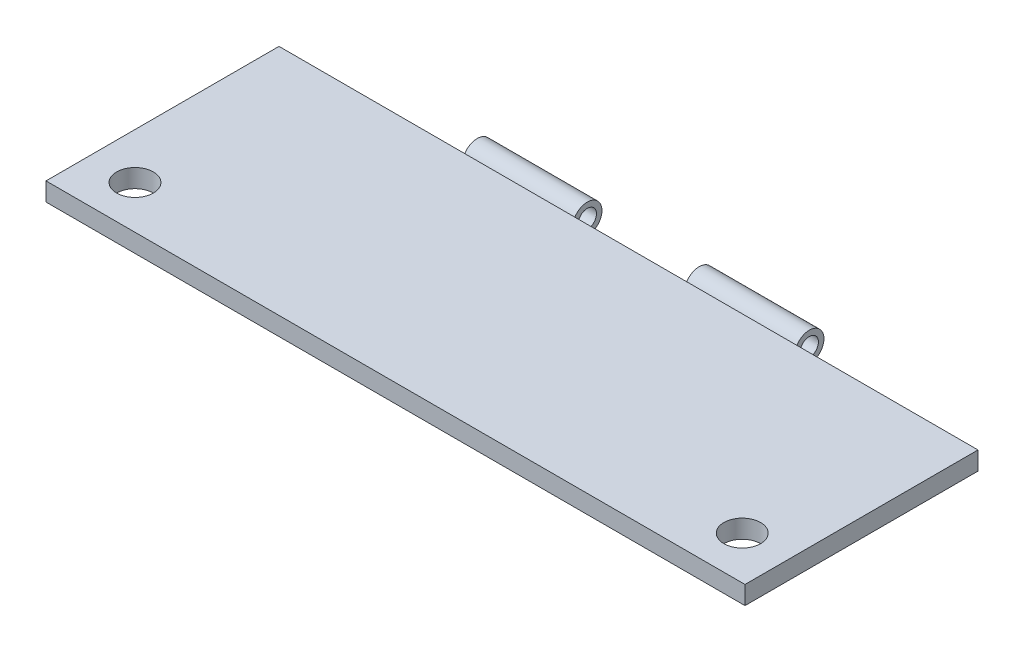
ISO-10303-21;
HEADER;
FILE_DESCRIPTION(('STEP AP214'),'2;1');
FILE_NAME('part.step','',(''),(''),'','','');
FILE_SCHEMA(('AUTOMOTIVE_DESIGN { 1 0 10303 214 1 1 1 1 }'));
ENDSEC;
DATA;
#1=APPLICATION_CONTEXT('core data for automotive mechanical design processes');
#2=APPLICATION_PROTOCOL_DEFINITION('international standard','automotive_design',2000,#1);
#3=PRODUCT_CONTEXT('',#1,'mechanical');
#4=PRODUCT('Part','Part','',(#3));
#5=PRODUCT_RELATED_PRODUCT_CATEGORY('part','',(#4));
#6=PRODUCT_DEFINITION_FORMATION('','',#4);
#7=PRODUCT_DEFINITION_CONTEXT('part definition',#1,'design');
#8=PRODUCT_DEFINITION('design','',#6,#7);
#9=PRODUCT_DEFINITION_SHAPE('','',#8);
#10=(LENGTH_UNIT() NAMED_UNIT(*) SI_UNIT(.MILLI.,.METRE.));
#11=(NAMED_UNIT(*) PLANE_ANGLE_UNIT() SI_UNIT($,.RADIAN.));
#12=(NAMED_UNIT(*) SI_UNIT($,.STERADIAN.) SOLID_ANGLE_UNIT());
#13=UNCERTAINTY_MEASURE_WITH_UNIT(LENGTH_MEASURE(1.E-05),#10,'distance_accuracy_value','');
#14=(GEOMETRIC_REPRESENTATION_CONTEXT(3) GLOBAL_UNCERTAINTY_ASSIGNED_CONTEXT((#13)) GLOBAL_UNIT_ASSIGNED_CONTEXT((#10,
#11,#12)) REPRESENTATION_CONTEXT('',''));
#15=CARTESIAN_POINT('',(0.,0.,0.));
#16=DIRECTION('',(0.,0.,1.));
#17=DIRECTION('',(1.,0.,0.));
#18=AXIS2_PLACEMENT_3D('',#15,#16,#17);
#19=CARTESIAN_POINT('',(42.6254833995939,0.901009784155106,-14.3061802949504));
#20=DIRECTION('',(-1.,0.,0.));
#21=DIRECTION('',(0.,0.,1.));
#22=AXIS2_PLACEMENT_3D('',#19,#20,#21);
#23=CYLINDRICAL_SURFACE('',#22,1.6);
#24=CARTESIAN_POINT('',(-18.1,0.901009784155106,-14.3061802949504));
#25=DIRECTION('',(-1.,0.,0.));
#26=DIRECTION('',(0.,0.,1.));
#27=AXIS2_PLACEMENT_3D('',#24,#25,#26);
#28=CIRCLE('',#27,1.6);
#29=CARTESIAN_POINT('',(-18.1,0.901009784155106,-12.7061802949504));
#30=VERTEX_POINT('',#29);
#31=EDGE_CURVE('E53',#30,#30,#28,.T.);
#32=ORIENTED_EDGE('',*,*,#31,.F.);
#33=EDGE_LOOP('',(#32));
#34=FACE_BOUND('',#33,.T.);
#35=CARTESIAN_POINT('',(-6.10000000000004,0.901009784155106,-14.3061802949504));
#36=DIRECTION('',(1.,0.,0.));
#37=DIRECTION('',(0.,0.,-1.));
#38=AXIS2_PLACEMENT_3D('',#35,#36,#37);
#39=CIRCLE('',#38,1.6);
#40=CARTESIAN_POINT('',(-6.10000000000004,0.901009784155106,-15.9061802949504));
#41=VERTEX_POINT('',#40);
#42=EDGE_CURVE('E44',#41,#41,#39,.F.);
#43=ORIENTED_EDGE('',*,*,#42,.T.);
#44=EDGE_LOOP('',(#43));
#45=FACE_BOUND('',#44,.T.);
#46=ADVANCED_FACE('F40',(#34,#45),#23,.T.);
#47=CARTESIAN_POINT('',(40.9284271247462,0.901009784155106,-14.3061802949504));
#48=DIRECTION('',(-1.,0.,0.));
#49=DIRECTION('',(0.,0.,1.));
#50=AXIS2_PLACEMENT_3D('',#47,#48,#49);
#51=CYLINDRICAL_SURFACE('',#50,1.);
#52=CARTESIAN_POINT('',(-18.1,0.901009784155106,-14.3061802949504));
#53=DIRECTION('',(-1.,0.,0.));
#54=DIRECTION('',(0.,0.,1.));
#55=AXIS2_PLACEMENT_3D('',#52,#53,#54);
#56=CIRCLE('',#55,1.);
#57=CARTESIAN_POINT('',(-18.1,0.901009784155106,-13.3061802949504));
#58=VERTEX_POINT('',#57);
#59=EDGE_CURVE('E48',#58,#58,#56,.F.);
#60=CARTESIAN_POINT('',(-6.10000000000004,0.901009784155106,-14.3061802949504));
#61=DIRECTION('',(1.,0.,0.));
#62=DIRECTION('',(0.,0.,-1.));
#63=AXIS2_PLACEMENT_3D('',#60,#61,#62);
#64=CIRCLE('',#63,1.);
#65=CARTESIAN_POINT('',(-6.10000000000004,0.901009784155106,-13.3061802949504));
#66=VERTEX_POINT('',#65);
#67=EDGE_CURVE('E11',#66,#66,#64,.F.);
#68=CARTESIAN_POINT('',(-18.1,0.901009784155106,-13.3061802949504));
#69=CARTESIAN_POINT('',(-17.975,0.901009784155106,-13.3061802949504));
#70=CARTESIAN_POINT('',(-17.85,0.901009784155106,-13.3061802949504));
#71=CARTESIAN_POINT('',(-17.6,0.901009784155106,-13.3061802949504));
#72=CARTESIAN_POINT('',(-17.475,0.901009784155106,-13.3061802949504));
#73=CARTESIAN_POINT('',(-17.225,0.901009784155106,-13.3061802949504));
#74=CARTESIAN_POINT('',(-17.1,0.901009784155106,-13.3061802949504));
#75=CARTESIAN_POINT('',(-16.85,0.901009784155106,-13.3061802949504));
#76=CARTESIAN_POINT('',(-16.725,0.901009784155106,-13.3061802949504));
#77=CARTESIAN_POINT('',(-16.475,0.901009784155106,-13.3061802949504));
#78=CARTESIAN_POINT('',(-16.35,0.901009784155106,-13.3061802949504));
#79=CARTESIAN_POINT('',(-16.1,0.901009784155106,-13.3061802949504));
#80=CARTESIAN_POINT('',(-15.975,0.901009784155106,-13.3061802949504));
#81=CARTESIAN_POINT('',(-15.725,0.901009784155106,-13.3061802949504));
#82=CARTESIAN_POINT('',(-15.6,0.901009784155106,-13.3061802949504));
#83=CARTESIAN_POINT('',(-15.35,0.901009784155106,-13.3061802949504));
#84=CARTESIAN_POINT('',(-15.225,0.901009784155106,-13.3061802949504));
#85=CARTESIAN_POINT('',(-14.975,0.901009784155106,-13.3061802949504));
#86=CARTESIAN_POINT('',(-14.85,0.901009784155106,-13.3061802949504));
#87=CARTESIAN_POINT('',(-14.6,0.901009784155106,-13.3061802949504));
#88=CARTESIAN_POINT('',(-14.475,0.901009784155106,-13.3061802949504));
#89=CARTESIAN_POINT('',(-14.225,0.901009784155106,-13.3061802949504));
#90=CARTESIAN_POINT('',(-14.1,0.901009784155106,-13.3061802949504));
#91=CARTESIAN_POINT('',(-13.85,0.901009784155106,-13.3061802949504));
#92=CARTESIAN_POINT('',(-13.725,0.901009784155106,-13.3061802949504));
#93=CARTESIAN_POINT('',(-13.475,0.901009784155106,-13.3061802949504));
#94=CARTESIAN_POINT('',(-13.35,0.901009784155106,-13.3061802949504));
#95=CARTESIAN_POINT('',(-13.1,0.901009784155106,-13.3061802949504));
#96=CARTESIAN_POINT('',(-12.975,0.901009784155106,-13.3061802949504));
#97=CARTESIAN_POINT('',(-12.725,0.901009784155106,-13.3061802949504));
#98=CARTESIAN_POINT('',(-12.6,0.901009784155106,-13.3061802949504));
#99=CARTESIAN_POINT('',(-12.35,0.901009784155106,-13.3061802949504));
#100=CARTESIAN_POINT('',(-12.225,0.901009784155106,-13.3061802949504));
#101=CARTESIAN_POINT('',(-11.975,0.901009784155106,-13.3061802949504));
#102=CARTESIAN_POINT('',(-11.85,0.901009784155106,-13.3061802949504));
#103=CARTESIAN_POINT('',(-11.6,0.901009784155106,-13.3061802949504));
#104=CARTESIAN_POINT('',(-11.475,0.901009784155106,-13.3061802949504));
#105=CARTESIAN_POINT('',(-11.225,0.901009784155106,-13.3061802949504));
#106=CARTESIAN_POINT('',(-11.1,0.901009784155106,-13.3061802949504));
#107=CARTESIAN_POINT('',(-10.85,0.901009784155106,-13.3061802949504));
#108=CARTESIAN_POINT('',(-10.725,0.901009784155106,-13.3061802949504));
#109=CARTESIAN_POINT('',(-10.475,0.901009784155106,-13.3061802949504));
#110=CARTESIAN_POINT('',(-10.35,0.901009784155106,-13.3061802949504));
#111=CARTESIAN_POINT('',(-10.1,0.901009784155106,-13.3061802949504));
#112=CARTESIAN_POINT('',(-9.97500000000002,0.901009784155106,-13.3061802949504));
#113=CARTESIAN_POINT('',(-9.72500000000002,0.901009784155106,-13.3061802949504));
#114=CARTESIAN_POINT('',(-9.60000000000002,0.901009784155106,-13.3061802949504));
#115=CARTESIAN_POINT('',(-9.35000000000002,0.901009784155106,-13.3061802949504));
#116=CARTESIAN_POINT('',(-9.22500000000002,0.901009784155106,-13.3061802949504));
#117=CARTESIAN_POINT('',(-8.97500000000002,0.901009784155106,-13.3061802949504));
#118=CARTESIAN_POINT('',(-8.85000000000002,0.901009784155106,-13.3061802949504));
#119=CARTESIAN_POINT('',(-8.60000000000003,0.901009784155106,-13.3061802949504));
#120=CARTESIAN_POINT('',(-8.47500000000003,0.901009784155106,-13.3061802949504));
#121=CARTESIAN_POINT('',(-8.22500000000003,0.901009784155106,-13.3061802949504));
#122=CARTESIAN_POINT('',(-8.10000000000003,0.901009784155106,-13.3061802949504));
#123=CARTESIAN_POINT('',(-7.85000000000003,0.901009784155106,-13.3061802949504));
#124=CARTESIAN_POINT('',(-7.72500000000003,0.901009784155106,-13.3061802949504));
#125=CARTESIAN_POINT('',(-7.47500000000003,0.901009784155106,-13.3061802949504));
#126=CARTESIAN_POINT('',(-7.35000000000003,0.901009784155106,-13.3061802949504));
#127=CARTESIAN_POINT('',(-7.10000000000004,0.901009784155106,-13.3061802949504));
#128=CARTESIAN_POINT('',(-6.97500000000004,0.901009784155106,-13.3061802949504));
#129=CARTESIAN_POINT('',(-6.72500000000004,0.901009784155106,-13.3061802949504));
#130=CARTESIAN_POINT('',(-6.60000000000004,0.901009784155106,-13.3061802949504));
#131=CARTESIAN_POINT('',(-6.35000000000004,0.901009784155106,-13.3061802949504));
#132=CARTESIAN_POINT('',(-6.22500000000004,0.901009784155106,-13.3061802949504));
#133=CARTESIAN_POINT('',(-6.10000000000004,0.901009784155106,-13.3061802949504));
#134=B_SPLINE_CURVE_WITH_KNOTS('',3,(#68,#69,#70,#71,#72,#73,#74,#75,#76,#77,#78,#79,#80,#81,
#82,#83,#84,#85,#86,#87,#88,#89,#90,#91,#92,#93,#94,#95,#96,#97,#98,#99,#100,#101,#102,#103,
#104,#105,#106,#107,#108,#109,#110,#111,#112,#113,#114,#115,#116,#117,#118,#119,#120,#121,#122,
#123,#124,#125,#126,#127,#128,#129,#130,#131,#132,#133),.UNSPECIFIED.,.F.,.F.,(4,2,2,2,2,2,2,2,
2,2,2,2,2,2,2,2,2,2,2,2,2,2,2,2,2,2,2,2,2,2,2,2,4),(0.,0.375,0.749999999999994,1.12499999999999,
1.49999999999999,1.87499999999999,2.24999999999998,2.62499999999998,2.99999999999998,
3.37499999999998,3.74999999999998,4.12499999999997,4.49999999999997,4.87499999999996,
5.24999999999996,5.62499999999996,5.99999999999996,6.37499999999995,6.74999999999995,
7.12499999999995,7.49999999999994,7.87499999999994,8.24999999999994,8.62499999999994,
8.99999999999994,9.37499999999993,9.74999999999993,10.1249999999999,10.4999999999999,
10.8749999999999,11.2499999999999,11.6249999999999,11.9999999999999),.UNSPECIFIED.);
#135=EDGE_CURVE('BSEAM42',#58,#66,#134,.T.);
#136=ORIENTED_EDGE('',*,*,#59,.F.);
#137=ORIENTED_EDGE('',*,*,#67,.F.);
#138=ORIENTED_EDGE('',*,*,#135,.T.);
#139=ORIENTED_EDGE('',*,*,#135,.F.);
#140=EDGE_LOOP('',(#136,#138,#137,#139));
#141=FACE_BOUND('',#140,.T.);
#142=ADVANCED_FACE('F42',(#141),#51,.F.);
#143=CARTESIAN_POINT('',(-18.1,-39.3377940817241,-15.9123605899008));
#144=DIRECTION('',(-1.,0.,0.));
#145=DIRECTION('',(0.,0.,1.));
#146=AXIS2_PLACEMENT_3D('',#143,#144,#145);
#147=PLANE('',#146);
#148=ORIENTED_EDGE('',*,*,#31,.T.);
#149=EDGE_LOOP('',(#148));
#150=FACE_BOUND('',#149,.T.);
#151=ORIENTED_EDGE('',*,*,#59,.T.);
#152=EDGE_LOOP('',(#151));
#153=FACE_BOUND('',#152,.T.);
#154=ADVANCED_FACE('F64',(#150,#153),#147,.T.);
#155=CARTESIAN_POINT('',(-6.10000000000004,-39.3377940817241,-12.7061802949504));
#156=DIRECTION('',(1.,0.,0.));
#157=DIRECTION('',(0.,0.,-1.));
#158=AXIS2_PLACEMENT_3D('',#155,#156,#157);
#159=PLANE('',#158);
#160=ORIENTED_EDGE('',*,*,#42,.F.);
#161=EDGE_LOOP('',(#160));
#162=FACE_BOUND('',#161,.T.);
#163=ORIENTED_EDGE('',*,*,#67,.T.);
#164=EDGE_LOOP('',(#163));
#165=FACE_BOUND('',#164,.T.);
#166=ADVANCED_FACE('F62',(#162,#165),#159,.T.);
#167=CLOSED_SHELL('',(#46,#142,#154,#166));
#168=MANIFOLD_SOLID_BREP('B2',#167);
#169=CARTESIAN_POINT('',(42.6254833995939,0.901009784155106,-14.3061802949504));
#170=DIRECTION('',(-1.,0.,0.));
#171=DIRECTION('',(0.,0.,1.));
#172=AXIS2_PLACEMENT_3D('',#169,#170,#171);
#173=CYLINDRICAL_SURFACE('',#172,1.6);
#174=CARTESIAN_POINT('',(6.10000000000004,0.901009784155106,-14.3061802949504));
#175=DIRECTION('',(1.,0.,0.));
#176=DIRECTION('',(0.,0.,-1.));
#177=AXIS2_PLACEMENT_3D('',#174,#175,#176);
#178=CIRCLE('',#177,1.6);
#179=CARTESIAN_POINT('',(6.10000000000004,0.901009784155106,-15.9061802949504));
#180=VERTEX_POINT('',#179);
#181=EDGE_CURVE('E129',#180,#180,#178,.F.);
#182=ORIENTED_EDGE('',*,*,#181,.F.);
#183=EDGE_LOOP('',(#182));
#184=FACE_BOUND('',#183,.T.);
#185=CARTESIAN_POINT('',(18.1,0.901009784155106,-14.3061802949504));
#186=DIRECTION('',(1.,0.,0.));
#187=DIRECTION('',(0.,0.,-1.));
#188=AXIS2_PLACEMENT_3D('',#185,#186,#187);
#189=CIRCLE('',#188,1.6);
#190=CARTESIAN_POINT('',(18.1,0.901009784155106,-15.9061802949504));
#191=VERTEX_POINT('',#190);
#192=EDGE_CURVE('E39',#191,#191,#189,.F.);
#193=ORIENTED_EDGE('',*,*,#192,.T.);
#194=EDGE_LOOP('',(#193));
#195=FACE_BOUND('',#194,.T.);
#196=ADVANCED_FACE('F117',(#184,#195),#173,.T.);
#197=CARTESIAN_POINT('',(18.1,-39.3377940817241,-12.7061802949504));
#198=DIRECTION('',(1.,0.,0.));
#199=DIRECTION('',(0.,0.,-1.));
#200=AXIS2_PLACEMENT_3D('',#197,#198,#199);
#201=PLANE('',#200);
#202=ORIENTED_EDGE('',*,*,#192,.F.);
#203=EDGE_LOOP('',(#202));
#204=FACE_BOUND('',#203,.T.);
#205=CARTESIAN_POINT('',(18.1,0.901009784155106,-14.3061802949504));
#206=DIRECTION('',(1.,0.,0.));
#207=DIRECTION('',(0.,0.,-1.));
#208=AXIS2_PLACEMENT_3D('',#205,#206,#207);
#209=CIRCLE('',#208,1.);
#210=CARTESIAN_POINT('',(18.1,0.901009784155106,-13.3061802949504));
#211=VERTEX_POINT('',#210);
#212=EDGE_CURVE('E124',#211,#211,#209,.F.);
#213=ORIENTED_EDGE('',*,*,#212,.T.);
#214=EDGE_LOOP('',(#213));
#215=FACE_BOUND('',#214,.T.);
#216=ADVANCED_FACE('F146',(#204,#215),#201,.T.);
#217=CARTESIAN_POINT('',(40.9284271247462,0.901009784155106,-14.3061802949504));
#218=DIRECTION('',(-1.,0.,0.));
#219=DIRECTION('',(0.,0.,1.));
#220=AXIS2_PLACEMENT_3D('',#217,#218,#219);
#221=CYLINDRICAL_SURFACE('',#220,1.);
#222=CARTESIAN_POINT('',(6.10000000000004,0.901009784155106,-14.3061802949504));
#223=DIRECTION('',(1.,0.,0.));
#224=DIRECTION('',(0.,0.,-1.));
#225=AXIS2_PLACEMENT_3D('',#222,#223,#224);
#226=CIRCLE('',#225,1.);
#227=CARTESIAN_POINT('',(6.10000000000003,0.901009784155106,-13.3061802949504));
#228=VERTEX_POINT('',#227);
#229=EDGE_CURVE('E120',#228,#228,#226,.F.);
#230=CARTESIAN_POINT('',(6.10000000000003,0.901009784155106,-13.3061802949504));
#231=CARTESIAN_POINT('',(6.22500000000003,0.901009784155106,-13.3061802949504));
#232=CARTESIAN_POINT('',(6.35000000000003,0.901009784155106,-13.3061802949504));
#233=CARTESIAN_POINT('',(6.60000000000003,0.901009784155106,-13.3061802949504));
#234=CARTESIAN_POINT('',(6.72500000000003,0.901009784155106,-13.3061802949504));
#235=CARTESIAN_POINT('',(6.97500000000003,0.901009784155106,-13.3061802949504));
#236=CARTESIAN_POINT('',(7.10000000000003,0.901009784155106,-13.3061802949504));
#237=CARTESIAN_POINT('',(7.35000000000003,0.901009784155106,-13.3061802949504));
#238=CARTESIAN_POINT('',(7.47500000000003,0.901009784155106,-13.3061802949504));
#239=CARTESIAN_POINT('',(7.72500000000003,0.901009784155106,-13.3061802949504));
#240=CARTESIAN_POINT('',(7.85000000000003,0.901009784155106,-13.3061802949504));
#241=CARTESIAN_POINT('',(8.10000000000003,0.901009784155106,-13.3061802949504));
#242=CARTESIAN_POINT('',(8.22500000000003,0.901009784155106,-13.3061802949504));
#243=CARTESIAN_POINT('',(8.47500000000003,0.901009784155106,-13.3061802949504));
#244=CARTESIAN_POINT('',(8.60000000000003,0.901009784155106,-13.3061802949504));
#245=CARTESIAN_POINT('',(8.85000000000003,0.901009784155106,-13.3061802949504));
#246=CARTESIAN_POINT('',(8.97500000000003,0.901009784155106,-13.3061802949504));
#247=CARTESIAN_POINT('',(9.22500000000003,0.901009784155106,-13.3061802949504));
#248=CARTESIAN_POINT('',(9.35000000000003,0.901009784155106,-13.3061802949504));
#249=CARTESIAN_POINT('',(9.60000000000003,0.901009784155106,-13.3061802949504));
#250=CARTESIAN_POINT('',(9.72500000000003,0.901009784155106,-13.3061802949504));
#251=CARTESIAN_POINT('',(9.97500000000003,0.901009784155106,-13.3061802949504));
#252=CARTESIAN_POINT('',(10.1,0.901009784155106,-13.3061802949504));
#253=CARTESIAN_POINT('',(10.35,0.901009784155106,-13.3061802949504));
#254=CARTESIAN_POINT('',(10.475,0.901009784155106,-13.3061802949504));
#255=CARTESIAN_POINT('',(10.725,0.901009784155106,-13.3061802949504));
#256=CARTESIAN_POINT('',(10.85,0.901009784155106,-13.3061802949504));
#257=CARTESIAN_POINT('',(11.1,0.901009784155106,-13.3061802949504));
#258=CARTESIAN_POINT('',(11.225,0.901009784155106,-13.3061802949504));
#259=CARTESIAN_POINT('',(11.475,0.901009784155106,-13.3061802949504));
#260=CARTESIAN_POINT('',(11.6,0.901009784155106,-13.3061802949504));
#261=CARTESIAN_POINT('',(11.85,0.901009784155106,-13.3061802949504));
#262=CARTESIAN_POINT('',(11.975,0.901009784155106,-13.3061802949504));
#263=CARTESIAN_POINT('',(12.225,0.901009784155106,-13.3061802949504));
#264=CARTESIAN_POINT('',(12.35,0.901009784155106,-13.3061802949504));
#265=CARTESIAN_POINT('',(12.6,0.901009784155106,-13.3061802949504));
#266=CARTESIAN_POINT('',(12.725,0.901009784155106,-13.3061802949504));
#267=CARTESIAN_POINT('',(12.975,0.901009784155106,-13.3061802949504));
#268=CARTESIAN_POINT('',(13.1,0.901009784155106,-13.3061802949504));
#269=CARTESIAN_POINT('',(13.35,0.901009784155106,-13.3061802949504));
#270=CARTESIAN_POINT('',(13.475,0.901009784155106,-13.3061802949504));
#271=CARTESIAN_POINT('',(13.725,0.901009784155106,-13.3061802949504));
#272=CARTESIAN_POINT('',(13.85,0.901009784155106,-13.3061802949504));
#273=CARTESIAN_POINT('',(14.1,0.901009784155106,-13.3061802949504));
#274=CARTESIAN_POINT('',(14.225,0.901009784155106,-13.3061802949504));
#275=CARTESIAN_POINT('',(14.475,0.901009784155106,-13.3061802949504));
#276=CARTESIAN_POINT('',(14.6,0.901009784155106,-13.3061802949504));
#277=CARTESIAN_POINT('',(14.85,0.901009784155106,-13.3061802949504));
#278=CARTESIAN_POINT('',(14.975,0.901009784155106,-13.3061802949504));
#279=CARTESIAN_POINT('',(15.225,0.901009784155106,-13.3061802949504));
#280=CARTESIAN_POINT('',(15.35,0.901009784155106,-13.3061802949504));
#281=CARTESIAN_POINT('',(15.6,0.901009784155106,-13.3061802949504));
#282=CARTESIAN_POINT('',(15.725,0.901009784155106,-13.3061802949504));
#283=CARTESIAN_POINT('',(15.975,0.901009784155106,-13.3061802949504));
#284=CARTESIAN_POINT('',(16.1,0.901009784155106,-13.3061802949504));
#285=CARTESIAN_POINT('',(16.35,0.901009784155106,-13.3061802949504));
#286=CARTESIAN_POINT('',(16.475,0.901009784155106,-13.3061802949504));
#287=CARTESIAN_POINT('',(16.725,0.901009784155106,-13.3061802949504));
#288=CARTESIAN_POINT('',(16.85,0.901009784155106,-13.3061802949504));
#289=CARTESIAN_POINT('',(17.1,0.901009784155106,-13.3061802949504));
#290=CARTESIAN_POINT('',(17.225,0.901009784155106,-13.3061802949504));
#291=CARTESIAN_POINT('',(17.475,0.901009784155106,-13.3061802949504));
#292=CARTESIAN_POINT('',(17.6,0.901009784155106,-13.3061802949504));
#293=CARTESIAN_POINT('',(17.85,0.901009784155106,-13.3061802949504));
#294=CARTESIAN_POINT('',(17.975,0.901009784155106,-13.3061802949504));
#295=CARTESIAN_POINT('',(18.1,0.901009784155106,-13.3061802949504));
#296=B_SPLINE_CURVE_WITH_KNOTS('',3,(#230,#231,#232,#233,#234,#235,#236,#237,#238,#239,#240,
#241,#242,#243,#244,#245,#246,#247,#248,#249,#250,#251,#252,#253,#254,#255,#256,#257,#258,#259,
#260,#261,#262,#263,#264,#265,#266,#267,#268,#269,#270,#271,#272,#273,#274,#275,#276,#277,#278,
#279,#280,#281,#282,#283,#284,#285,#286,#287,#288,#289,#290,#291,#292,#293,#294,#295),
.UNSPECIFIED.,.F.,.F.,(4,2,2,2,2,2,2,2,2,2,2,2,2,2,2,2,2,2,2,2,2,2,2,2,2,2,2,2,2,2,2,2,4),(0.,
0.375,0.750000000000001,1.125,1.5,1.875,2.25,2.625,3.,3.375,3.75,4.125,4.5,4.875,5.25,5.625,6.,
6.375,6.75,7.125,7.5,7.875,8.25,8.625,9.,9.375,9.75,10.125,10.5,10.875,11.25,11.625,12.),.UNSPECIFIED.);
#297=EDGE_CURVE('BSEAM137',#228,#211,#296,.T.);
#298=ORIENTED_EDGE('',*,*,#229,.T.);
#299=ORIENTED_EDGE('',*,*,#212,.F.);
#300=ORIENTED_EDGE('',*,*,#297,.T.);
#301=ORIENTED_EDGE('',*,*,#297,.F.);
#302=EDGE_LOOP('',(#298,#300,#299,#301));
#303=FACE_BOUND('',#302,.T.);
#304=ADVANCED_FACE('F137',(#303),#221,.F.);
#305=CARTESIAN_POINT('',(6.10000000000004,-39.3377940817241,-12.7061802949504));
#306=DIRECTION('',(1.,0.,0.));
#307=DIRECTION('',(0.,0.,-1.));
#308=AXIS2_PLACEMENT_3D('',#305,#306,#307);
#309=PLANE('',#308);
#310=ORIENTED_EDGE('',*,*,#181,.T.);
#311=EDGE_LOOP('',(#310));
#312=FACE_BOUND('',#311,.T.);
#313=ORIENTED_EDGE('',*,*,#229,.F.);
#314=EDGE_LOOP('',(#313));
#315=FACE_BOUND('',#314,.T.);
#316=ADVANCED_FACE('F140',(#312,#315),#309,.F.);
#317=CLOSED_SHELL('',(#196,#216,#304,#316));
#318=MANIFOLD_SOLID_BREP('B6',#317);
#319=CARTESIAN_POINT('',(38.1,2.,12.7));
#320=DIRECTION('',(-1.,0.,0.));
#321=DIRECTION('',(0.,0.,1.));
#322=AXIS2_PLACEMENT_3D('',#319,#320,#321);
#323=PLANE('',#322);
#324=DIRECTION('',(0.,0.,-1.));
#325=VECTOR('',#324,1.);
#326=CARTESIAN_POINT('',(38.1,0.,12.7));
#327=LINE('',#326,#325);
#328=CARTESIAN_POINT('',(38.1,0.,12.7));
#329=VERTEX_POINT('',#328);
#330=CARTESIAN_POINT('',(38.1,0.,-12.7));
#331=VERTEX_POINT('',#330);
#332=EDGE_CURVE('E254',#329,#331,#327,.T.);
#333=ORIENTED_EDGE('',*,*,#332,.T.);
#334=DIRECTION('',(0.,-1.,0.));
#335=VECTOR('',#334,1.);
#336=CARTESIAN_POINT('',(38.1,2.,-12.7));
#337=LINE('',#336,#335);
#338=CARTESIAN_POINT('',(38.1,2.,-12.7));
#339=VERTEX_POINT('',#338);
#340=EDGE_CURVE('E115',#339,#331,#337,.T.);
#341=ORIENTED_EDGE('',*,*,#340,.F.);
#342=DIRECTION('',(0.,0.,-1.));
#343=VECTOR('',#342,1.);
#344=CARTESIAN_POINT('',(38.1,2.,12.7));
#345=LINE('',#344,#343);
#346=CARTESIAN_POINT('',(38.1,2.,12.7));
#347=VERTEX_POINT('',#346);
#348=EDGE_CURVE('E242',#347,#339,#345,.T.);
#349=ORIENTED_EDGE('',*,*,#348,.F.);
#350=DIRECTION('',(0.,-1.,0.));
#351=VECTOR('',#350,1.);
#352=CARTESIAN_POINT('',(38.1,2.,12.7));
#353=LINE('',#352,#351);
#354=EDGE_CURVE('E250',#347,#329,#353,.T.);
#355=ORIENTED_EDGE('',*,*,#354,.T.);
#356=EDGE_LOOP('',(#333,#341,#349,#355));
#357=FACE_BOUND('',#356,.T.);
#358=ADVANCED_FACE('F191',(#357),#323,.F.);
#359=CARTESIAN_POINT('',(-38.1,2.,-12.7));
#360=DIRECTION('',(0.,0.,1.));
#361=DIRECTION('',(1.,0.,0.));
#362=AXIS2_PLACEMENT_3D('',#359,#360,#361);
#363=PLANE('',#362);
#364=DIRECTION('',(-1.,0.,0.));
#365=VECTOR('',#364,1.);
#366=CARTESIAN_POINT('',(-38.1,0.,-12.7));
#367=LINE('',#366,#365);
#368=CARTESIAN_POINT('',(-38.1,0.,-12.7));
#369=VERTEX_POINT('',#368);
#370=EDGE_CURVE('E246',#331,#369,#367,.T.);
#371=ORIENTED_EDGE('',*,*,#370,.T.);
#372=DIRECTION('',(0.,-1.,0.));
#373=VECTOR('',#372,1.);
#374=CARTESIAN_POINT('',(-38.1,2.,-12.7));
#375=LINE('',#374,#373);
#376=CARTESIAN_POINT('',(-38.1,2.,-12.7));
#377=VERTEX_POINT('',#376);
#378=EDGE_CURVE('E199',#377,#369,#375,.T.);
#379=ORIENTED_EDGE('',*,*,#378,.F.);
#380=DIRECTION('',(-1.,0.,0.));
#381=VECTOR('',#380,1.);
#382=CARTESIAN_POINT('',(-38.1,2.,-12.7));
#383=LINE('',#382,#381);
#384=EDGE_CURVE('E237',#339,#377,#383,.T.);
#385=ORIENTED_EDGE('',*,*,#384,.F.);
#386=ORIENTED_EDGE('',*,*,#340,.T.);
#387=EDGE_LOOP('',(#371,#379,#385,#386));
#388=FACE_BOUND('',#387,.T.);
#389=ADVANCED_FACE('F245',(#388),#363,.F.);
#390=CARTESIAN_POINT('',(-38.1,2.,12.7));
#391=DIRECTION('',(1.,0.,0.));
#392=DIRECTION('',(0.,0.,-1.));
#393=AXIS2_PLACEMENT_3D('',#390,#391,#392);
#394=PLANE('',#393);
#395=DIRECTION('',(0.,0.,1.));
#396=VECTOR('',#395,1.);
#397=CARTESIAN_POINT('',(-38.1,0.,12.7));
#398=LINE('',#397,#396);
#399=CARTESIAN_POINT('',(-38.1,0.,12.7));
#400=VERTEX_POINT('',#399);
#401=EDGE_CURVE('E224',#369,#400,#398,.T.);
#402=ORIENTED_EDGE('',*,*,#401,.T.);
#403=DIRECTION('',(0.,-1.,0.));
#404=VECTOR('',#403,1.);
#405=CARTESIAN_POINT('',(-38.1,2.,12.7));
#406=LINE('',#405,#404);
#407=CARTESIAN_POINT('',(-38.1,2.,12.7));
#408=VERTEX_POINT('',#407);
#409=EDGE_CURVE('E247',#408,#400,#406,.T.);
#410=ORIENTED_EDGE('',*,*,#409,.F.);
#411=DIRECTION('',(0.,0.,1.));
#412=VECTOR('',#411,1.);
#413=CARTESIAN_POINT('',(-38.1,2.,12.7));
#414=LINE('',#413,#412);
#415=EDGE_CURVE('E240',#377,#408,#414,.T.);
#416=ORIENTED_EDGE('',*,*,#415,.F.);
#417=ORIENTED_EDGE('',*,*,#378,.T.);
#418=EDGE_LOOP('',(#402,#410,#416,#417));
#419=FACE_BOUND('',#418,.T.);
#420=ADVANCED_FACE('F248',(#419),#394,.F.);
#421=CARTESIAN_POINT('',(-38.1,2.,12.7));
#422=DIRECTION('',(0.,0.,-1.));
#423=DIRECTION('',(-1.,0.,0.));
#424=AXIS2_PLACEMENT_3D('',#421,#422,#423);
#425=PLANE('',#424);
#426=DIRECTION('',(1.,0.,0.));
#427=VECTOR('',#426,1.);
#428=CARTESIAN_POINT('',(-38.1,0.,12.7));
#429=LINE('',#428,#427);
#430=EDGE_CURVE('E230',#400,#329,#429,.T.);
#431=ORIENTED_EDGE('',*,*,#430,.T.);
#432=ORIENTED_EDGE('',*,*,#354,.F.);
#433=DIRECTION('',(1.,0.,0.));
#434=VECTOR('',#433,1.);
#435=CARTESIAN_POINT('',(-38.1,2.,12.7));
#436=LINE('',#435,#434);
#437=EDGE_CURVE('E207',#408,#347,#436,.T.);
#438=ORIENTED_EDGE('',*,*,#437,.F.);
#439=ORIENTED_EDGE('',*,*,#409,.T.);
#440=EDGE_LOOP('',(#431,#432,#438,#439));
#441=FACE_BOUND('',#440,.T.);
#442=ADVANCED_FACE('F262',(#441),#425,.F.);
#443=CARTESIAN_POINT('',(0.,2.,0.));
#444=DIRECTION('',(0.,-1.,0.));
#445=DIRECTION('',(0.,0.,-1.));
#446=AXIS2_PLACEMENT_3D('',#443,#444,#445);
#447=PLANE('',#446);
#448=CARTESIAN_POINT('',(33.1,2.,8.));
#449=DIRECTION('',(0.,1.,0.));
#450=DIRECTION('',(0.,0.,1.));
#451=AXIS2_PLACEMENT_3D('',#448,#449,#450);
#452=CIRCLE('',#451,2.);
#453=CARTESIAN_POINT('',(33.1,2.,10.));
#454=VERTEX_POINT('',#453);
#455=EDGE_CURVE('E274',#454,#454,#452,.T.);
#456=ORIENTED_EDGE('',*,*,#455,.F.);
#457=EDGE_LOOP('',(#456));
#458=FACE_BOUND('',#457,.T.);
#459=CARTESIAN_POINT('',(-33.1,2.,8.));
#460=DIRECTION('',(0.,1.,0.));
#461=DIRECTION('',(0.,0.,1.));
#462=AXIS2_PLACEMENT_3D('',#459,#460,#461);
#463=CIRCLE('',#462,2.);
#464=CARTESIAN_POINT('',(-33.1,2.,10.));
#465=VERTEX_POINT('',#464);
#466=EDGE_CURVE('E268',#465,#465,#463,.T.);
#467=ORIENTED_EDGE('',*,*,#466,.F.);
#468=EDGE_LOOP('',(#467));
#469=FACE_BOUND('',#468,.T.);
#470=ORIENTED_EDGE('',*,*,#348,.T.);
#471=ORIENTED_EDGE('',*,*,#384,.T.);
#472=ORIENTED_EDGE('',*,*,#415,.T.);
#473=ORIENTED_EDGE('',*,*,#437,.T.);
#474=EDGE_LOOP('',(#470,#471,#472,#473));
#475=FACE_BOUND('',#474,.T.);
#476=ADVANCED_FACE('F238',(#458,#469,#475),#447,.F.);
#477=CARTESIAN_POINT('',(0.,0.,0.));
#478=DIRECTION('',(0.,-1.,0.));
#479=DIRECTION('',(0.,0.,-1.));
#480=AXIS2_PLACEMENT_3D('',#477,#478,#479);
#481=PLANE('',#480);
#482=CARTESIAN_POINT('',(33.1,0.,8.));
#483=DIRECTION('',(0.,1.,0.));
#484=DIRECTION('',(0.,0.,1.));
#485=AXIS2_PLACEMENT_3D('',#482,#483,#484);
#486=CIRCLE('',#485,2.);
#487=CARTESIAN_POINT('',(33.1,0.,10.));
#488=VERTEX_POINT('',#487);
#489=EDGE_CURVE('E271',#488,#488,#486,.T.);
#490=ORIENTED_EDGE('',*,*,#489,.T.);
#491=EDGE_LOOP('',(#490));
#492=FACE_BOUND('',#491,.T.);
#493=CARTESIAN_POINT('',(-33.1,0.,8.));
#494=DIRECTION('',(0.,1.,0.));
#495=DIRECTION('',(0.,0.,1.));
#496=AXIS2_PLACEMENT_3D('',#493,#494,#495);
#497=CIRCLE('',#496,2.);
#498=CARTESIAN_POINT('',(-33.1,0.,10.));
#499=VERTEX_POINT('',#498);
#500=EDGE_CURVE('E257',#499,#499,#497,.T.);
#501=ORIENTED_EDGE('',*,*,#500,.T.);
#502=EDGE_LOOP('',(#501));
#503=FACE_BOUND('',#502,.T.);
#504=ORIENTED_EDGE('',*,*,#332,.F.);
#505=ORIENTED_EDGE('',*,*,#430,.F.);
#506=ORIENTED_EDGE('',*,*,#401,.F.);
#507=ORIENTED_EDGE('',*,*,#370,.F.);
#508=EDGE_LOOP('',(#504,#505,#506,#507));
#509=FACE_BOUND('',#508,.T.);
#510=ADVANCED_FACE('F265',(#492,#503,#509),#481,.T.);
#511=CARTESIAN_POINT('',(-33.1,0.,8.));
#512=DIRECTION('',(0.,1.,0.));
#513=DIRECTION('',(0.,0.,1.));
#514=AXIS2_PLACEMENT_3D('',#511,#512,#513);
#515=CYLINDRICAL_SURFACE('',#514,2.);
#516=ORIENTED_EDGE('',*,*,#500,.F.);
#517=EDGE_LOOP('',(#516));
#518=FACE_BOUND('',#517,.T.);
#519=ORIENTED_EDGE('',*,*,#466,.T.);
#520=EDGE_LOOP('',(#519));
#521=FACE_BOUND('',#520,.T.);
#522=ADVANCED_FACE('F285',(#518,#521),#515,.F.);
#523=CARTESIAN_POINT('',(33.1,0.,8.));
#524=DIRECTION('',(0.,1.,0.));
#525=DIRECTION('',(0.,0.,1.));
#526=AXIS2_PLACEMENT_3D('',#523,#524,#525);
#527=CYLINDRICAL_SURFACE('',#526,2.);
#528=ORIENTED_EDGE('',*,*,#489,.F.);
#529=EDGE_LOOP('',(#528));
#530=FACE_BOUND('',#529,.T.);
#531=ORIENTED_EDGE('',*,*,#455,.T.);
#532=EDGE_LOOP('',(#531));
#533=FACE_BOUND('',#532,.T.);
#534=ADVANCED_FACE('F282',(#530,#533),#527,.F.);
#535=CLOSED_SHELL('',(#358,#389,#420,#442,#476,#510,#522,#534));
#536=MANIFOLD_SOLID_BREP('B34',#535);
#537=ADVANCED_BREP_SHAPE_REPRESENTATION('',(#18,#168,#318,#536),#14);
#538=SHAPE_DEFINITION_REPRESENTATION(#9,#537);
ENDSEC;
END-ISO-10303-21;
